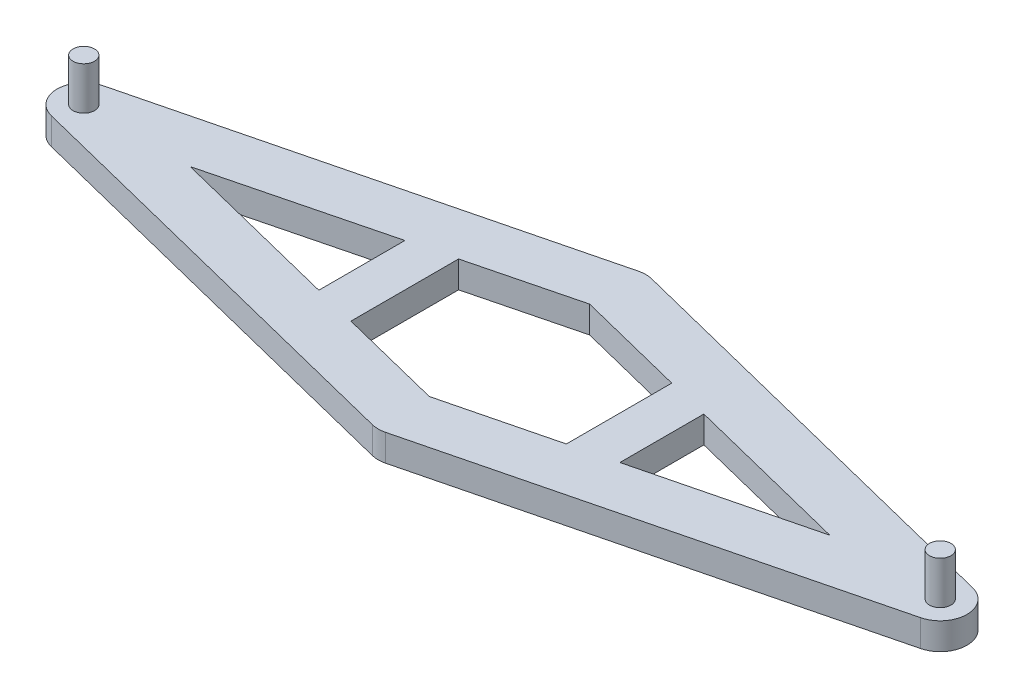
ISO-10303-21;
HEADER;
FILE_DESCRIPTION(('STEP AP214'),'2;1');
FILE_NAME('part.step','',(''),(''),'','','');
FILE_SCHEMA(('AUTOMOTIVE_DESIGN { 1 0 10303 214 1 1 1 1 }'));
ENDSEC;
DATA;
#1=APPLICATION_CONTEXT('core data for automotive mechanical design processes');
#2=APPLICATION_PROTOCOL_DEFINITION('international standard','automotive_design',2000,#1);
#3=PRODUCT_CONTEXT('',#1,'mechanical');
#4=PRODUCT('Part','Part','',(#3));
#5=PRODUCT_RELATED_PRODUCT_CATEGORY('part','',(#4));
#6=PRODUCT_DEFINITION_FORMATION('','',#4);
#7=PRODUCT_DEFINITION_CONTEXT('part definition',#1,'design');
#8=PRODUCT_DEFINITION('design','',#6,#7);
#9=PRODUCT_DEFINITION_SHAPE('','',#8);
#10=(LENGTH_UNIT() NAMED_UNIT(*) SI_UNIT(.MILLI.,.METRE.));
#11=(NAMED_UNIT(*) PLANE_ANGLE_UNIT() SI_UNIT($,.RADIAN.));
#12=(NAMED_UNIT(*) SI_UNIT($,.STERADIAN.) SOLID_ANGLE_UNIT());
#13=UNCERTAINTY_MEASURE_WITH_UNIT(LENGTH_MEASURE(1.E-05),#10,'distance_accuracy_value','');
#14=(GEOMETRIC_REPRESENTATION_CONTEXT(3) GLOBAL_UNCERTAINTY_ASSIGNED_CONTEXT((#13)) GLOBAL_UNIT_ASSIGNED_CONTEXT((#10,
#11,#12)) REPRESENTATION_CONTEXT('',''));
#15=CARTESIAN_POINT('',(0.,0.,0.));
#16=DIRECTION('',(0.,0.,1.));
#17=DIRECTION('',(1.,0.,0.));
#18=AXIS2_PLACEMENT_3D('',#15,#16,#17);
#19=CARTESIAN_POINT('',(-0.294525173858239,3.175,-9.50091620313037));
#20=DIRECTION('',(-0.242535625036084,0.,0.970142500145394));
#21=DIRECTION('',(0.970142500145394,0.,0.242535625036084));
#22=AXIS2_PLACEMENT_3D('',#19,#20,#21);
#23=PLANE('',#22);
#24=DIRECTION('',(0.,-1.,0.));
#25=VECTOR('',#24,1.);
#26=CARTESIAN_POINT('',(12.7,3.175,-6.25228490966936));
#27=LINE('',#26,#25);
#28=CARTESIAN_POINT('',(12.7,3.175,-6.25228490966936));
#29=VERTEX_POINT('',#28);
#30=CARTESIAN_POINT('',(12.7,0.,-6.25228490966936));
#31=VERTEX_POINT('',#30);
#32=EDGE_CURVE('E171',#29,#31,#27,.T.);
#33=ORIENTED_EDGE('',*,*,#32,.F.);
#34=DIRECTION('',(-0.970142500145394,0.,-0.242535625036084));
#35=VECTOR('',#34,1.);
#36=CARTESIAN_POINT('',(-0.294525173858239,3.175,-9.50091620313037));
#37=LINE('',#36,#35);
#38=CARTESIAN_POINT('',(-0.294525173858239,3.175,-9.50091620313037));
#39=VERTEX_POINT('',#38);
#40=EDGE_CURVE('E187',#29,#39,#37,.T.);
#41=ORIENTED_EDGE('',*,*,#40,.T.);
#42=DIRECTION('',(0.,-1.,0.));
#43=VECTOR('',#42,1.);
#44=CARTESIAN_POINT('',(-0.294525173858239,3.175,-9.50091620313037));
#45=LINE('',#44,#43);
#46=CARTESIAN_POINT('',(-0.294525173858239,0.,-9.50091620313037));
#47=VERTEX_POINT('',#46);
#48=EDGE_CURVE('E204',#39,#47,#45,.T.);
#49=ORIENTED_EDGE('',*,*,#48,.T.);
#50=DIRECTION('',(-0.970142500145394,0.,-0.242535625036084));
#51=VECTOR('',#50,1.);
#52=CARTESIAN_POINT('',(-0.294525173858239,0.,-9.50091620313037));
#53=LINE('',#52,#51);
#54=EDGE_CURVE('E289',#31,#47,#53,.T.);
#55=ORIENTED_EDGE('',*,*,#54,.F.);
#56=EDGE_LOOP('',(#33,#41,#49,#55));
#57=FACE_BOUND('',#56,.T.);
#58=ADVANCED_FACE('F33',(#57),#23,.T.);
#59=CARTESIAN_POINT('',(37.7091396387047,3.175,0.));
#60=DIRECTION('',(-0.242535625036085,0.,-0.970142500145394));
#61=DIRECTION('',(-0.970142500145394,0.,0.242535625036085));
#62=AXIS2_PLACEMENT_3D('',#59,#60,#61);
#63=PLANE('',#62);
#64=DIRECTION('',(0.,1.,0.));
#65=VECTOR('',#64,1.);
#66=CARTESIAN_POINT('',(12.7,3.175,6.2522849096694));
#67=LINE('',#66,#65);
#68=CARTESIAN_POINT('',(12.7,0.,6.2522849096694));
#69=VERTEX_POINT('',#68);
#70=CARTESIAN_POINT('',(12.7,3.175,6.2522849096694));
#71=VERTEX_POINT('',#70);
#72=EDGE_CURVE('E11',#69,#71,#67,.T.);
#73=ORIENTED_EDGE('',*,*,#72,.F.);
#74=DIRECTION('',(0.970142500145394,0.,-0.242535625036085));
#75=VECTOR('',#74,1.);
#76=CARTESIAN_POINT('',(37.7091396387047,0.,0.));
#77=LINE('',#76,#75);
#78=CARTESIAN_POINT('',(-0.307385689264475,0.,9.50413133198198));
#79=VERTEX_POINT('',#78);
#80=EDGE_CURVE('E180',#79,#69,#77,.T.);
#81=ORIENTED_EDGE('',*,*,#80,.F.);
#82=DIRECTION('',(0.,-1.,0.));
#83=VECTOR('',#82,1.);
#84=CARTESIAN_POINT('',(-0.307385689264475,3.175,9.50413133198198));
#85=LINE('',#84,#83);
#86=CARTESIAN_POINT('',(-0.307385689264472,3.175,9.50413133198199));
#87=VERTEX_POINT('',#86);
#88=EDGE_CURVE('E199',#87,#79,#85,.T.);
#89=ORIENTED_EDGE('',*,*,#88,.F.);
#90=DIRECTION('',(0.970142500145394,0.,-0.242535625036085));
#91=VECTOR('',#90,1.);
#92=CARTESIAN_POINT('',(37.7091396387047,3.175,0.));
#93=LINE('',#92,#91);
#94=EDGE_CURVE('E182',#87,#71,#93,.T.);
#95=ORIENTED_EDGE('',*,*,#94,.T.);
#96=EDGE_LOOP('',(#73,#81,#89,#95));
#97=FACE_BOUND('',#96,.T.);
#98=ADVANCED_FACE('F178',(#97),#63,.T.);
#99=CARTESIAN_POINT('',(-38.111149391785,3.175,0.0652214884911534));
#100=DIRECTION('',(0.245236567026518,0.,0.969463267067426));
#101=DIRECTION('',(0.969463267067426,0.,-0.245236567026518));
#102=AXIS2_PLACEMENT_3D('',#99,#100,#101);
#103=PLANE('',#102);
#104=DIRECTION('',(0.,1.,0.));
#105=VECTOR('',#104,1.);
#106=CARTESIAN_POINT('',(-12.7,3.175,-6.36281271634266));
#107=LINE('',#106,#105);
#108=CARTESIAN_POINT('',(-12.7,0.,-6.36281271634266));
#109=VERTEX_POINT('',#108);
#110=CARTESIAN_POINT('',(-12.7,3.175,-6.36281271634266));
#111=VERTEX_POINT('',#110);
#112=EDGE_CURVE('E331',#109,#111,#107,.T.);
#113=ORIENTED_EDGE('',*,*,#112,.F.);
#114=DIRECTION('',(-0.969463267067426,0.,0.245236567026518));
#115=VECTOR('',#114,1.);
#116=CARTESIAN_POINT('',(-38.111149391785,0.,0.0652214884911534));
#117=LINE('',#116,#115);
#118=EDGE_CURVE('E291',#47,#109,#117,.T.);
#119=ORIENTED_EDGE('',*,*,#118,.F.);
#120=ORIENTED_EDGE('',*,*,#48,.F.);
#121=DIRECTION('',(-0.969463267067426,0.,0.245236567026518));
#122=VECTOR('',#121,1.);
#123=CARTESIAN_POINT('',(-38.111149391785,3.175,0.0652214884911534));
#124=LINE('',#123,#122);
#125=EDGE_CURVE('E344',#39,#111,#124,.T.);
#126=ORIENTED_EDGE('',*,*,#125,.T.);
#127=EDGE_LOOP('',(#113,#119,#120,#126));
#128=FACE_BOUND('',#127,.T.);
#129=ADVANCED_FACE('F367',(#128),#103,.T.);
#130=CARTESIAN_POINT('',(-0.307385689264475,3.175,9.50413133198198));
#131=DIRECTION('',(0.242245005364423,0.,-0.970215108816592));
#132=DIRECTION('',(-0.970215108816592,0.,-0.242245005364423));
#133=AXIS2_PLACEMENT_3D('',#130,#131,#132);
#134=PLANE('',#133);
#135=DIRECTION('',(0.,-1.,0.));
#136=VECTOR('',#135,1.);
#137=CARTESIAN_POINT('',(-12.7,3.175,6.40992171505996));
#138=LINE('',#137,#136);
#139=CARTESIAN_POINT('',(-12.7,3.175,6.40992171505996));
#140=VERTEX_POINT('',#139);
#141=CARTESIAN_POINT('',(-12.7,0.,6.40992171505996));
#142=VERTEX_POINT('',#141);
#143=EDGE_CURVE('E267',#140,#142,#138,.T.);
#144=ORIENTED_EDGE('',*,*,#143,.F.);
#145=DIRECTION('',(0.970215108816592,0.,0.242245005364423));
#146=VECTOR('',#145,1.);
#147=CARTESIAN_POINT('',(-0.307385689264475,3.175,9.50413133198198));
#148=LINE('',#147,#146);
#149=EDGE_CURVE('E346',#140,#87,#148,.T.);
#150=ORIENTED_EDGE('',*,*,#149,.T.);
#151=ORIENTED_EDGE('',*,*,#88,.T.);
#152=DIRECTION('',(0.970215108816592,0.,0.242245005364423));
#153=VECTOR('',#152,1.);
#154=CARTESIAN_POINT('',(-0.307385689264475,0.,9.50413133198198));
#155=LINE('',#154,#153);
#156=EDGE_CURVE('E185',#142,#79,#155,.T.);
#157=ORIENTED_EDGE('',*,*,#156,.F.);
#158=EDGE_LOOP('',(#144,#150,#151,#157));
#159=FACE_BOUND('',#158,.T.);
#160=ADVANCED_FACE('F351',(#159),#134,.T.);
#161=CARTESIAN_POINT('',(-50.8000000000543,3.175,0.));
#162=DIRECTION('',(0.,1.,0.));
#163=DIRECTION('',(0.,0.,1.));
#164=AXIS2_PLACEMENT_3D('',#161,#162,#163);
#165=PLANE('',#164);
#166=ORIENTED_EDGE('',*,*,#40,.F.);
#167=DIRECTION('',(0.,0.,1.));
#168=VECTOR('',#167,1.);
#169=CARTESIAN_POINT('',(12.7,3.175,8.25500000000475));
#170=LINE('',#169,#168);
#171=EDGE_CURVE('E173',#29,#71,#170,.T.);
#172=ORIENTED_EDGE('',*,*,#171,.T.);
#173=ORIENTED_EDGE('',*,*,#94,.F.);
#174=ORIENTED_EDGE('',*,*,#149,.F.);
#175=DIRECTION('',(0.,0.,-1.));
#176=VECTOR('',#175,1.);
#177=CARTESIAN_POINT('',(-12.7,3.175,8.25500000000467));
#178=LINE('',#177,#176);
#179=EDGE_CURVE('E320',#140,#111,#178,.T.);
#180=ORIENTED_EDGE('',*,*,#179,.T.);
#181=ORIENTED_EDGE('',*,*,#125,.F.);
#182=EDGE_LOOP('',(#166,#172,#173,#174,#180,#181));
#183=FACE_BOUND('',#182,.T.);
#184=CARTESIAN_POINT('',(17.78,3.175,4.98228490967078));
#185=VERTEX_POINT('',#184);
#186=CARTESIAN_POINT('',(37.7091396387047,3.175,0.));
#187=VERTEX_POINT('',#186);
#188=EDGE_CURVE('E347',#185,#187,#93,.T.);
#189=ORIENTED_EDGE('',*,*,#188,.F.);
#190=DIRECTION('',(0.,0.,-1.));
#191=VECTOR('',#190,1.);
#192=CARTESIAN_POINT('',(17.78,3.175,8.25500000000475));
#193=LINE('',#192,#191);
#194=CARTESIAN_POINT('',(17.78,3.175,-4.98228490967074));
#195=VERTEX_POINT('',#194);
#196=EDGE_CURVE('E275',#185,#195,#193,.T.);
#197=ORIENTED_EDGE('',*,*,#196,.T.);
#198=EDGE_CURVE('E190',#187,#195,#37,.T.);
#199=ORIENTED_EDGE('',*,*,#198,.F.);
#200=EDGE_LOOP('',(#189,#197,#199));
#201=FACE_BOUND('',#200,.T.);
#202=CARTESIAN_POINT('',(-17.78,3.175,-5.07776994802489));
#203=VERTEX_POINT('',#202);
#204=CARTESIAN_POINT('',(-38.111149391785,3.175,0.0652214884911534));
#205=VERTEX_POINT('',#204);
#206=EDGE_CURVE('E319',#203,#205,#124,.T.);
#207=ORIENTED_EDGE('',*,*,#206,.F.);
#208=DIRECTION('',(0.,0.,1.));
#209=VECTOR('',#208,1.);
#210=CARTESIAN_POINT('',(-17.78,3.175,-8.25500000000475));
#211=LINE('',#210,#209);
#212=CARTESIAN_POINT('',(-17.78,3.175,5.14153842967463));
#213=VERTEX_POINT('',#212);
#214=EDGE_CURVE('E313',#203,#213,#211,.T.);
#215=ORIENTED_EDGE('',*,*,#214,.T.);
#216=EDGE_CURVE('E309',#205,#213,#148,.T.);
#217=ORIENTED_EDGE('',*,*,#216,.F.);
#218=EDGE_LOOP('',(#207,#215,#217));
#219=FACE_BOUND('',#218,.T.);
#220=CARTESIAN_POINT('',(50.8000000000543,3.175,0.));
#221=DIRECTION('',(0.,1.,0.));
#222=DIRECTION('',(0.,0.,1.));
#223=AXIS2_PLACEMENT_3D('',#220,#221,#222);
#224=CIRCLE('',#223,1.27);
#225=CARTESIAN_POINT('',(50.8000000000543,3.175,1.27));
#226=VERTEX_POINT('',#225);
#227=EDGE_CURVE('E333',#226,#226,#224,.T.);
#228=ORIENTED_EDGE('',*,*,#227,.F.);
#229=EDGE_LOOP('',(#228));
#230=FACE_BOUND('',#229,.T.);
#231=CARTESIAN_POINT('',(-50.8000000000543,3.175,0.));
#232=DIRECTION('',(0.,1.,0.));
#233=DIRECTION('',(0.,0.,1.));
#234=AXIS2_PLACEMENT_3D('',#231,#232,#233);
#235=CIRCLE('',#234,1.27);
#236=CARTESIAN_POINT('',(-50.8000000000543,3.175,1.27));
#237=VERTEX_POINT('',#236);
#238=EDGE_CURVE('E337',#237,#237,#235,.T.);
#239=ORIENTED_EDGE('',*,*,#238,.F.);
#240=EDGE_LOOP('',(#239));
#241=FACE_BOUND('',#240,.T.);
#242=CARTESIAN_POINT('',(-50.8000000000543,3.175,0.));
#243=DIRECTION('',(0.,1.,0.));
#244=DIRECTION('',(0.,0.,1.));
#245=AXIS2_PLACEMENT_3D('',#242,#243,#244);
#246=CIRCLE('',#245,3.175);
#247=CARTESIAN_POINT('',(-51.5700506095438,3.175,-3.08020243796162));
#248=VERTEX_POINT('',#247);
#249=CARTESIAN_POINT('',(-51.5700506095438,3.175,3.08020243796162));
#250=VERTEX_POINT('',#249);
#251=EDGE_CURVE('E208',#248,#250,#246,.T.);
#252=ORIENTED_EDGE('',*,*,#251,.T.);
#253=DIRECTION('',(0.970142500145393,0.,0.242535625036088));
#254=VECTOR('',#253,1.);
#255=CARTESIAN_POINT('',(-51.5700506095438,3.175,3.08020243796162));
#256=LINE('',#255,#254);
#257=CARTESIAN_POINT('',(-0.77005060948961,3.175,15.7802024379616));
#258=VERTEX_POINT('',#257);
#259=EDGE_CURVE('E211',#250,#258,#256,.T.);
#260=ORIENTED_EDGE('',*,*,#259,.T.);
#261=CARTESIAN_POINT('',(0.,3.175,12.6999999999999));
#262=DIRECTION('',(0.,1.,0.));
#263=DIRECTION('',(0.,0.,1.));
#264=AXIS2_PLACEMENT_3D('',#261,#262,#263);
#265=CIRCLE('',#264,3.17500000000012);
#266=CARTESIAN_POINT('',(0.770050609489601,3.175,15.7802024379617));
#267=VERTEX_POINT('',#266);
#268=EDGE_CURVE('E214',#258,#267,#265,.T.);
#269=ORIENTED_EDGE('',*,*,#268,.T.);
#270=DIRECTION('',(0.970142500145393,0.,-0.24253562503609));
#271=VECTOR('',#270,1.);
#272=CARTESIAN_POINT('',(51.5700506095438,3.175,3.08020243796162));
#273=LINE('',#272,#271);
#274=CARTESIAN_POINT('',(51.5700506095438,3.175,3.08020243796162));
#275=VERTEX_POINT('',#274);
#276=EDGE_CURVE('E216',#267,#275,#273,.T.);
#277=ORIENTED_EDGE('',*,*,#276,.T.);
#278=CARTESIAN_POINT('',(50.8000000000543,3.175,0.));
#279=DIRECTION('',(0.,1.,0.));
#280=DIRECTION('',(0.,0.,1.));
#281=AXIS2_PLACEMENT_3D('',#278,#279,#280);
#282=CIRCLE('',#281,3.175);
#283=CARTESIAN_POINT('',(51.5700506095438,3.175,-3.08020243796162));
#284=VERTEX_POINT('',#283);
#285=EDGE_CURVE('E218',#275,#284,#282,.T.);
#286=ORIENTED_EDGE('',*,*,#285,.T.);
#287=DIRECTION('',(-0.970142500145393,0.,-0.24253562503609));
#288=VECTOR('',#287,1.);
#289=CARTESIAN_POINT('',(0.770050609489601,3.175,-15.7802024379617));
#290=LINE('',#289,#288);
#291=CARTESIAN_POINT('',(0.7700506094896,3.175,-15.7802024379617));
#292=VERTEX_POINT('',#291);
#293=EDGE_CURVE('E220',#284,#292,#290,.T.);
#294=ORIENTED_EDGE('',*,*,#293,.T.);
#295=CARTESIAN_POINT('',(0.,3.175,-12.7));
#296=DIRECTION('',(0.,1.,0.));
#297=DIRECTION('',(0.,0.,1.));
#298=AXIS2_PLACEMENT_3D('',#295,#296,#297);
#299=CIRCLE('',#298,3.17500000000006);
#300=CARTESIAN_POINT('',(-0.770050609489601,3.175,-15.7802024379617));
#301=VERTEX_POINT('',#300);
#302=EDGE_CURVE('E222',#292,#301,#299,.T.);
#303=ORIENTED_EDGE('',*,*,#302,.T.);
#304=DIRECTION('',(-0.970142500145393,0.,0.24253562503609));
#305=VECTOR('',#304,1.);
#306=CARTESIAN_POINT('',(-51.5700506095438,3.175,-3.08020243796162));
#307=LINE('',#306,#305);
#308=EDGE_CURVE('E224',#301,#248,#307,.T.);
#309=ORIENTED_EDGE('',*,*,#308,.T.);
#310=EDGE_LOOP('',(#252,#260,#269,#277,#286,#294,#303,#309));
#311=FACE_BOUND('',#310,.T.);
#312=ADVANCED_FACE('F317',(#183,#201,#219,#230,#241,#311),#165,.T.);
#313=CARTESIAN_POINT('',(-50.8000000000543,0.,0.));
#314=DIRECTION('',(0.,1.,0.));
#315=DIRECTION('',(0.,0.,1.));
#316=AXIS2_PLACEMENT_3D('',#313,#314,#315);
#317=PLANE('',#316);
#318=DIRECTION('',(0.,0.,-1.));
#319=VECTOR('',#318,1.);
#320=CARTESIAN_POINT('',(12.7,0.,8.25500000000475));
#321=LINE('',#320,#319);
#322=EDGE_CURVE('E48',#69,#31,#321,.T.);
#323=ORIENTED_EDGE('',*,*,#322,.T.);
#324=ORIENTED_EDGE('',*,*,#54,.T.);
#325=ORIENTED_EDGE('',*,*,#118,.T.);
#326=DIRECTION('',(0.,0.,1.));
#327=VECTOR('',#326,1.);
#328=CARTESIAN_POINT('',(-12.7,0.,8.25500000000467));
#329=LINE('',#328,#327);
#330=EDGE_CURVE('E323',#109,#142,#329,.T.);
#331=ORIENTED_EDGE('',*,*,#330,.T.);
#332=ORIENTED_EDGE('',*,*,#156,.T.);
#333=ORIENTED_EDGE('',*,*,#80,.T.);
#334=EDGE_LOOP('',(#323,#324,#325,#331,#332,#333));
#335=FACE_BOUND('',#334,.T.);
#336=DIRECTION('',(0.,0.,1.));
#337=VECTOR('',#336,1.);
#338=CARTESIAN_POINT('',(17.78,0.,8.25500000000475));
#339=LINE('',#338,#337);
#340=CARTESIAN_POINT('',(17.78,0.,-4.98228490967074));
#341=VERTEX_POINT('',#340);
#342=CARTESIAN_POINT('',(17.78,0.,4.98228490967077));
#343=VERTEX_POINT('',#342);
#344=EDGE_CURVE('E56',#341,#343,#339,.T.);
#345=ORIENTED_EDGE('',*,*,#344,.T.);
#346=CARTESIAN_POINT('',(37.7091396387047,0.,0.));
#347=VERTEX_POINT('',#346);
#348=EDGE_CURVE('E188',#343,#347,#77,.T.);
#349=ORIENTED_EDGE('',*,*,#348,.T.);
#350=EDGE_CURVE('E282',#347,#341,#53,.T.);
#351=ORIENTED_EDGE('',*,*,#350,.T.);
#352=EDGE_LOOP('',(#345,#349,#351));
#353=FACE_BOUND('',#352,.T.);
#354=DIRECTION('',(0.,0.,-1.));
#355=VECTOR('',#354,1.);
#356=CARTESIAN_POINT('',(-17.78,0.,-8.25500000000475));
#357=LINE('',#356,#355);
#358=CARTESIAN_POINT('',(-17.78,0.,5.14153842967463));
#359=VERTEX_POINT('',#358);
#360=CARTESIAN_POINT('',(-17.78,0.,-5.07776994802489));
#361=VERTEX_POINT('',#360);
#362=EDGE_CURVE('E300',#359,#361,#357,.T.);
#363=ORIENTED_EDGE('',*,*,#362,.T.);
#364=CARTESIAN_POINT('',(-38.111149391785,0.,0.0652214884911534));
#365=VERTEX_POINT('',#364);
#366=EDGE_CURVE('E288',#361,#365,#117,.T.);
#367=ORIENTED_EDGE('',*,*,#366,.T.);
#368=EDGE_CURVE('E192',#365,#359,#155,.T.);
#369=ORIENTED_EDGE('',*,*,#368,.T.);
#370=EDGE_LOOP('',(#363,#367,#369));
#371=FACE_BOUND('',#370,.T.);
#372=CARTESIAN_POINT('',(-50.8000000000543,0.,0.));
#373=DIRECTION('',(0.,1.,0.));
#374=DIRECTION('',(0.,0.,1.));
#375=AXIS2_PLACEMENT_3D('',#372,#373,#374);
#376=CIRCLE('',#375,3.175);
#377=CARTESIAN_POINT('',(-51.5700506095438,0.,-3.08020243796162));
#378=VERTEX_POINT('',#377);
#379=CARTESIAN_POINT('',(-51.5700506095438,0.,3.08020243796162));
#380=VERTEX_POINT('',#379);
#381=EDGE_CURVE('E207',#378,#380,#376,.T.);
#382=ORIENTED_EDGE('',*,*,#381,.F.);
#383=DIRECTION('',(-0.970142500145393,0.,0.24253562503609));
#384=VECTOR('',#383,1.);
#385=CARTESIAN_POINT('',(-51.5700506095438,0.,-3.08020243796162));
#386=LINE('',#385,#384);
#387=CARTESIAN_POINT('',(-0.770050609489601,0.,-15.7802024379617));
#388=VERTEX_POINT('',#387);
#389=EDGE_CURVE('E212',#388,#378,#386,.T.);
#390=ORIENTED_EDGE('',*,*,#389,.F.);
#391=CARTESIAN_POINT('',(0.,0.,-12.7));
#392=DIRECTION('',(0.,1.,0.));
#393=DIRECTION('',(0.,0.,1.));
#394=AXIS2_PLACEMENT_3D('',#391,#392,#393);
#395=CIRCLE('',#394,3.17500000000006);
#396=CARTESIAN_POINT('',(0.7700506094896,0.,-15.7802024379617));
#397=VERTEX_POINT('',#396);
#398=EDGE_CURVE('E239',#397,#388,#395,.T.);
#399=ORIENTED_EDGE('',*,*,#398,.F.);
#400=DIRECTION('',(-0.970142500145393,0.,-0.24253562503609));
#401=VECTOR('',#400,1.);
#402=CARTESIAN_POINT('',(0.770050609489601,0.,-15.7802024379617));
#403=LINE('',#402,#401);
#404=CARTESIAN_POINT('',(51.5700506095438,0.,-3.08020243796162));
#405=VERTEX_POINT('',#404);
#406=EDGE_CURVE('E237',#405,#397,#403,.T.);
#407=ORIENTED_EDGE('',*,*,#406,.F.);
#408=CARTESIAN_POINT('',(50.8000000000543,0.,0.));
#409=DIRECTION('',(0.,1.,0.));
#410=DIRECTION('',(0.,0.,1.));
#411=AXIS2_PLACEMENT_3D('',#408,#409,#410);
#412=CIRCLE('',#411,3.175);
#413=CARTESIAN_POINT('',(51.5700506095438,0.,3.08020243796162));
#414=VERTEX_POINT('',#413);
#415=EDGE_CURVE('E235',#414,#405,#412,.T.);
#416=ORIENTED_EDGE('',*,*,#415,.F.);
#417=DIRECTION('',(0.970142500145393,0.,-0.24253562503609));
#418=VECTOR('',#417,1.);
#419=CARTESIAN_POINT('',(51.5700506095438,0.,3.08020243796162));
#420=LINE('',#419,#418);
#421=CARTESIAN_POINT('',(0.770050609489601,0.,15.7802024379617));
#422=VERTEX_POINT('',#421);
#423=EDGE_CURVE('E233',#422,#414,#420,.T.);
#424=ORIENTED_EDGE('',*,*,#423,.F.);
#425=CARTESIAN_POINT('',(0.,0.,12.6999999999999));
#426=DIRECTION('',(0.,1.,0.));
#427=DIRECTION('',(0.,0.,1.));
#428=AXIS2_PLACEMENT_3D('',#425,#426,#427);
#429=CIRCLE('',#428,3.17500000000012);
#430=CARTESIAN_POINT('',(-0.77005060948961,0.,15.7802024379616));
#431=VERTEX_POINT('',#430);
#432=EDGE_CURVE('E231',#431,#422,#429,.T.);
#433=ORIENTED_EDGE('',*,*,#432,.F.);
#434=DIRECTION('',(0.970142500145393,0.,0.242535625036088));
#435=VECTOR('',#434,1.);
#436=CARTESIAN_POINT('',(-51.5700506095438,0.,3.08020243796162));
#437=LINE('',#436,#435);
#438=EDGE_CURVE('E229',#380,#431,#437,.T.);
#439=ORIENTED_EDGE('',*,*,#438,.F.);
#440=EDGE_LOOP('',(#382,#390,#399,#407,#416,#424,#433,#439));
#441=FACE_BOUND('',#440,.T.);
#442=ADVANCED_FACE('F183',(#335,#353,#371,#441),#317,.F.);
#443=CARTESIAN_POINT('',(-50.8000000000543,3.175,0.));
#444=DIRECTION('',(0.,-1.,0.));
#445=DIRECTION('',(0.,0.,-1.));
#446=AXIS2_PLACEMENT_3D('',#443,#444,#445);
#447=CYLINDRICAL_SURFACE('',#446,3.175);
#448=ORIENTED_EDGE('',*,*,#381,.T.);
#449=DIRECTION('',(0.,-1.,0.));
#450=VECTOR('',#449,1.);
#451=CARTESIAN_POINT('',(-51.5700506095438,3.175,3.08020243796162));
#452=LINE('',#451,#450);
#453=EDGE_CURVE('E262',#250,#380,#452,.T.);
#454=ORIENTED_EDGE('',*,*,#453,.F.);
#455=ORIENTED_EDGE('',*,*,#251,.F.);
#456=DIRECTION('',(0.,-1.,0.));
#457=VECTOR('',#456,1.);
#458=CARTESIAN_POINT('',(-51.5700506095438,3.175,-3.08020243796162));
#459=LINE('',#458,#457);
#460=EDGE_CURVE('E226',#248,#378,#459,.T.);
#461=ORIENTED_EDGE('',*,*,#460,.T.);
#462=EDGE_LOOP('',(#448,#454,#455,#461));
#463=FACE_BOUND('',#462,.T.);
#464=ADVANCED_FACE('F35',(#463),#447,.T.);
#465=CARTESIAN_POINT('',(-51.5700506095438,3.175,3.08020243796162));
#466=DIRECTION('',(0.242535625036088,0.,-0.970142500145393));
#467=DIRECTION('',(-0.970142500145393,0.,-0.242535625036088));
#468=AXIS2_PLACEMENT_3D('',#465,#466,#467);
#469=PLANE('',#468);
#470=ORIENTED_EDGE('',*,*,#438,.T.);
#471=DIRECTION('',(0.,-1.,0.));
#472=VECTOR('',#471,1.);
#473=CARTESIAN_POINT('',(-0.77005060948961,3.175,15.7802024379616));
#474=LINE('',#473,#472);
#475=EDGE_CURVE('E259',#258,#431,#474,.T.);
#476=ORIENTED_EDGE('',*,*,#475,.F.);
#477=ORIENTED_EDGE('',*,*,#259,.F.);
#478=ORIENTED_EDGE('',*,*,#453,.T.);
#479=EDGE_LOOP('',(#470,#476,#477,#478));
#480=FACE_BOUND('',#479,.T.);
#481=ADVANCED_FACE('F408',(#480),#469,.F.);
#482=CARTESIAN_POINT('',(0.,3.175,12.6999999999999));
#483=DIRECTION('',(0.,-1.,0.));
#484=DIRECTION('',(0.,0.,-1.));
#485=AXIS2_PLACEMENT_3D('',#482,#483,#484);
#486=CYLINDRICAL_SURFACE('',#485,3.17500000000012);
#487=ORIENTED_EDGE('',*,*,#432,.T.);
#488=DIRECTION('',(0.,-1.,0.));
#489=VECTOR('',#488,1.);
#490=CARTESIAN_POINT('',(0.770050609489601,3.175,15.7802024379617));
#491=LINE('',#490,#489);
#492=EDGE_CURVE('E256',#267,#422,#491,.T.);
#493=ORIENTED_EDGE('',*,*,#492,.F.);
#494=ORIENTED_EDGE('',*,*,#268,.F.);
#495=ORIENTED_EDGE('',*,*,#475,.T.);
#496=EDGE_LOOP('',(#487,#493,#494,#495));
#497=FACE_BOUND('',#496,.T.);
#498=ADVANCED_FACE('F405',(#497),#486,.T.);
#499=CARTESIAN_POINT('',(51.5700506095438,3.175,3.08020243796162));
#500=DIRECTION('',(-0.24253562503609,0.,-0.970142500145392));
#501=DIRECTION('',(-0.970142500145393,0.,0.24253562503609));
#502=AXIS2_PLACEMENT_3D('',#499,#500,#501);
#503=PLANE('',#502);
#504=ORIENTED_EDGE('',*,*,#423,.T.);
#505=DIRECTION('',(0.,-1.,0.));
#506=VECTOR('',#505,1.);
#507=CARTESIAN_POINT('',(51.5700506095438,3.175,3.08020243796162));
#508=LINE('',#507,#506);
#509=EDGE_CURVE('E253',#275,#414,#508,.T.);
#510=ORIENTED_EDGE('',*,*,#509,.F.);
#511=ORIENTED_EDGE('',*,*,#276,.F.);
#512=ORIENTED_EDGE('',*,*,#492,.T.);
#513=EDGE_LOOP('',(#504,#510,#511,#512));
#514=FACE_BOUND('',#513,.T.);
#515=ADVANCED_FACE('F401',(#514),#503,.F.);
#516=CARTESIAN_POINT('',(50.8000000000543,3.175,0.));
#517=DIRECTION('',(0.,-1.,0.));
#518=DIRECTION('',(0.,0.,-1.));
#519=AXIS2_PLACEMENT_3D('',#516,#517,#518);
#520=CYLINDRICAL_SURFACE('',#519,3.175);
#521=ORIENTED_EDGE('',*,*,#415,.T.);
#522=DIRECTION('',(0.,-1.,0.));
#523=VECTOR('',#522,1.);
#524=CARTESIAN_POINT('',(51.5700506095438,3.175,-3.08020243796162));
#525=LINE('',#524,#523);
#526=EDGE_CURVE('E250',#284,#405,#525,.T.);
#527=ORIENTED_EDGE('',*,*,#526,.F.);
#528=ORIENTED_EDGE('',*,*,#285,.F.);
#529=ORIENTED_EDGE('',*,*,#509,.T.);
#530=EDGE_LOOP('',(#521,#527,#528,#529));
#531=FACE_BOUND('',#530,.T.);
#532=ADVANCED_FACE('F397',(#531),#520,.T.);
#533=CARTESIAN_POINT('',(0.770050609489601,3.175,-15.7802024379617));
#534=DIRECTION('',(-0.24253562503609,0.,0.970142500145392));
#535=DIRECTION('',(0.970142500145393,0.,0.24253562503609));
#536=AXIS2_PLACEMENT_3D('',#533,#534,#535);
#537=PLANE('',#536);
#538=ORIENTED_EDGE('',*,*,#406,.T.);
#539=DIRECTION('',(0.,-1.,0.));
#540=VECTOR('',#539,1.);
#541=CARTESIAN_POINT('',(0.7700506094896,3.175,-15.7802024379617));
#542=LINE('',#541,#540);
#543=EDGE_CURVE('E247',#292,#397,#542,.T.);
#544=ORIENTED_EDGE('',*,*,#543,.F.);
#545=ORIENTED_EDGE('',*,*,#293,.F.);
#546=ORIENTED_EDGE('',*,*,#526,.T.);
#547=EDGE_LOOP('',(#538,#544,#545,#546));
#548=FACE_BOUND('',#547,.T.);
#549=ADVANCED_FACE('F391',(#548),#537,.F.);
#550=CARTESIAN_POINT('',(0.,3.175,-12.7));
#551=DIRECTION('',(0.,-1.,0.));
#552=DIRECTION('',(0.,0.,-1.));
#553=AXIS2_PLACEMENT_3D('',#550,#551,#552);
#554=CYLINDRICAL_SURFACE('',#553,3.17500000000006);
#555=ORIENTED_EDGE('',*,*,#398,.T.);
#556=DIRECTION('',(0.,-1.,0.));
#557=VECTOR('',#556,1.);
#558=CARTESIAN_POINT('',(-0.770050609489601,3.175,-15.7802024379617));
#559=LINE('',#558,#557);
#560=EDGE_CURVE('E244',#301,#388,#559,.T.);
#561=ORIENTED_EDGE('',*,*,#560,.F.);
#562=ORIENTED_EDGE('',*,*,#302,.F.);
#563=ORIENTED_EDGE('',*,*,#543,.T.);
#564=EDGE_LOOP('',(#555,#561,#562,#563));
#565=FACE_BOUND('',#564,.T.);
#566=ADVANCED_FACE('F385',(#565),#554,.T.);
#567=CARTESIAN_POINT('',(-51.5700506095438,3.175,-3.08020243796162));
#568=DIRECTION('',(0.24253562503609,0.,0.970142500145392));
#569=DIRECTION('',(0.970142500145393,0.,-0.24253562503609));
#570=AXIS2_PLACEMENT_3D('',#567,#568,#569);
#571=PLANE('',#570);
#572=ORIENTED_EDGE('',*,*,#389,.T.);
#573=ORIENTED_EDGE('',*,*,#460,.F.);
#574=ORIENTED_EDGE('',*,*,#308,.F.);
#575=ORIENTED_EDGE('',*,*,#560,.T.);
#576=EDGE_LOOP('',(#572,#573,#574,#575));
#577=FACE_BOUND('',#576,.T.);
#578=ADVANCED_FACE('F379',(#577),#571,.F.);
#579=DIRECTION('',(0.,1.,0.));
#580=VECTOR('',#579,1.);
#581=CARTESIAN_POINT('',(17.78,3.175,-4.98228490967075));
#582=LINE('',#581,#580);
#583=EDGE_CURVE('E287',#341,#195,#582,.T.);
#584=ORIENTED_EDGE('',*,*,#583,.F.);
#585=ORIENTED_EDGE('',*,*,#350,.F.);
#586=DIRECTION('',(0.,-1.,0.));
#587=VECTOR('',#586,1.);
#588=CARTESIAN_POINT('',(37.7091396387047,3.175,0.));
#589=LINE('',#588,#587);
#590=EDGE_CURVE('E196',#187,#347,#589,.T.);
#591=ORIENTED_EDGE('',*,*,#590,.F.);
#592=ORIENTED_EDGE('',*,*,#198,.T.);
#593=EDGE_LOOP('',(#584,#585,#591,#592));
#594=FACE_BOUND('',#593,.T.);
#595=ADVANCED_FACE('F284',(#594),#23,.T.);
#596=DIRECTION('',(0.,-1.,0.));
#597=VECTOR('',#596,1.);
#598=CARTESIAN_POINT('',(-17.78,3.175,-5.07776994802489));
#599=LINE('',#598,#597);
#600=EDGE_CURVE('E329',#203,#361,#599,.T.);
#601=ORIENTED_EDGE('',*,*,#600,.F.);
#602=ORIENTED_EDGE('',*,*,#206,.T.);
#603=DIRECTION('',(0.,-1.,0.));
#604=VECTOR('',#603,1.);
#605=CARTESIAN_POINT('',(-38.111149391785,3.175,0.0652214884911534));
#606=LINE('',#605,#604);
#607=EDGE_CURVE('E201',#205,#365,#606,.T.);
#608=ORIENTED_EDGE('',*,*,#607,.T.);
#609=ORIENTED_EDGE('',*,*,#366,.F.);
#610=EDGE_LOOP('',(#601,#602,#608,#609));
#611=FACE_BOUND('',#610,.T.);
#612=ADVANCED_FACE('F378',(#611),#103,.T.);
#613=DIRECTION('',(0.,1.,0.));
#614=VECTOR('',#613,1.);
#615=CARTESIAN_POINT('',(-17.78,3.175,5.14153842967463));
#616=LINE('',#615,#614);
#617=EDGE_CURVE('E265',#359,#213,#616,.T.);
#618=ORIENTED_EDGE('',*,*,#617,.F.);
#619=ORIENTED_EDGE('',*,*,#368,.F.);
#620=ORIENTED_EDGE('',*,*,#607,.F.);
#621=ORIENTED_EDGE('',*,*,#216,.T.);
#622=EDGE_LOOP('',(#618,#619,#620,#621));
#623=FACE_BOUND('',#622,.T.);
#624=ADVANCED_FACE('F306',(#623),#134,.T.);
#625=DIRECTION('',(0.,-1.,0.));
#626=VECTOR('',#625,1.);
#627=CARTESIAN_POINT('',(17.78,3.175,4.98228490967077));
#628=LINE('',#627,#626);
#629=EDGE_CURVE('E41',#185,#343,#628,.T.);
#630=ORIENTED_EDGE('',*,*,#629,.F.);
#631=ORIENTED_EDGE('',*,*,#188,.T.);
#632=ORIENTED_EDGE('',*,*,#590,.T.);
#633=ORIENTED_EDGE('',*,*,#348,.F.);
#634=EDGE_LOOP('',(#630,#631,#632,#633));
#635=FACE_BOUND('',#634,.T.);
#636=ADVANCED_FACE('F278',(#635),#63,.T.);
#637=CARTESIAN_POINT('',(-50.8000000000543,8.255,0.));
#638=DIRECTION('',(0.,-1.,0.));
#639=DIRECTION('',(0.,0.,-1.));
#640=AXIS2_PLACEMENT_3D('',#637,#638,#639);
#641=CYLINDRICAL_SURFACE('',#640,1.27);
#642=CARTESIAN_POINT('',(-50.8000000000543,8.255,0.));
#643=DIRECTION('',(0.,1.,0.));
#644=DIRECTION('',(0.,0.,1.));
#645=AXIS2_PLACEMENT_3D('',#642,#643,#644);
#646=CIRCLE('',#645,1.27);
#647=CARTESIAN_POINT('',(-50.8000000000543,8.255,1.27));
#648=VERTEX_POINT('',#647);
#649=EDGE_CURVE('E292',#648,#648,#646,.T.);
#650=ORIENTED_EDGE('',*,*,#649,.F.);
#651=EDGE_LOOP('',(#650));
#652=FACE_BOUND('',#651,.T.);
#653=ORIENTED_EDGE('',*,*,#238,.T.);
#654=EDGE_LOOP('',(#653));
#655=FACE_BOUND('',#654,.T.);
#656=ADVANCED_FACE('F477',(#652,#655),#641,.T.);
#657=CARTESIAN_POINT('',(-50.8000000000543,8.255,0.));
#658=DIRECTION('',(0.,1.,0.));
#659=DIRECTION('',(0.,0.,1.));
#660=AXIS2_PLACEMENT_3D('',#657,#658,#659);
#661=PLANE('',#660);
#662=ORIENTED_EDGE('',*,*,#649,.T.);
#663=EDGE_LOOP('',(#662));
#664=FACE_BOUND('',#663,.T.);
#665=ADVANCED_FACE('F523',(#664),#661,.T.);
#666=CARTESIAN_POINT('',(50.8000000000543,8.255,0.));
#667=DIRECTION('',(0.,-1.,0.));
#668=DIRECTION('',(0.,0.,-1.));
#669=AXIS2_PLACEMENT_3D('',#666,#667,#668);
#670=CYLINDRICAL_SURFACE('',#669,1.27);
#671=CARTESIAN_POINT('',(50.8000000000543,8.255,0.));
#672=DIRECTION('',(0.,1.,0.));
#673=DIRECTION('',(0.,0.,1.));
#674=AXIS2_PLACEMENT_3D('',#671,#672,#673);
#675=CIRCLE('',#674,1.27);
#676=CARTESIAN_POINT('',(50.8000000000543,8.255,1.27));
#677=VERTEX_POINT('',#676);
#678=EDGE_CURVE('E334',#677,#677,#675,.T.);
#679=ORIENTED_EDGE('',*,*,#678,.F.);
#680=EDGE_LOOP('',(#679));
#681=FACE_BOUND('',#680,.T.);
#682=ORIENTED_EDGE('',*,*,#227,.T.);
#683=EDGE_LOOP('',(#682));
#684=FACE_BOUND('',#683,.T.);
#685=ADVANCED_FACE('F519',(#681,#684),#670,.T.);
#686=CARTESIAN_POINT('',(50.8000000000543,8.255,0.));
#687=DIRECTION('',(0.,1.,0.));
#688=DIRECTION('',(0.,0.,1.));
#689=AXIS2_PLACEMENT_3D('',#686,#687,#688);
#690=PLANE('',#689);
#691=ORIENTED_EDGE('',*,*,#678,.T.);
#692=EDGE_LOOP('',(#691));
#693=FACE_BOUND('',#692,.T.);
#694=ADVANCED_FACE('F487',(#693),#690,.T.);
#695=CARTESIAN_POINT('',(-12.7,-17.273867546103,8.25500000000467));
#696=DIRECTION('',(1.,0.,0.));
#697=DIRECTION('',(0.,0.,-1.));
#698=AXIS2_PLACEMENT_3D('',#695,#696,#697);
#699=PLANE('',#698);
#700=ORIENTED_EDGE('',*,*,#330,.F.);
#701=ORIENTED_EDGE('',*,*,#112,.T.);
#702=ORIENTED_EDGE('',*,*,#179,.F.);
#703=ORIENTED_EDGE('',*,*,#143,.T.);
#704=EDGE_LOOP('',(#700,#701,#702,#703));
#705=FACE_BOUND('',#704,.T.);
#706=ADVANCED_FACE('F483',(#705),#699,.T.);
#707=CARTESIAN_POINT('',(-17.78,-17.273867546103,-8.25500000000475));
#708=DIRECTION('',(-1.,0.,0.));
#709=DIRECTION('',(0.,0.,1.));
#710=AXIS2_PLACEMENT_3D('',#707,#708,#709);
#711=PLANE('',#710);
#712=ORIENTED_EDGE('',*,*,#214,.F.);
#713=ORIENTED_EDGE('',*,*,#600,.T.);
#714=ORIENTED_EDGE('',*,*,#362,.F.);
#715=ORIENTED_EDGE('',*,*,#617,.T.);
#716=EDGE_LOOP('',(#712,#713,#714,#715));
#717=FACE_BOUND('',#716,.T.);
#718=ADVANCED_FACE('F312',(#717),#711,.T.);
#719=CARTESIAN_POINT('',(12.7,-17.273867546103,8.25500000000475));
#720=DIRECTION('',(-1.,0.,0.));
#721=DIRECTION('',(0.,0.,1.));
#722=AXIS2_PLACEMENT_3D('',#719,#720,#721);
#723=PLANE('',#722);
#724=ORIENTED_EDGE('',*,*,#171,.F.);
#725=ORIENTED_EDGE('',*,*,#32,.T.);
#726=ORIENTED_EDGE('',*,*,#322,.F.);
#727=ORIENTED_EDGE('',*,*,#72,.T.);
#728=EDGE_LOOP('',(#724,#725,#726,#727));
#729=FACE_BOUND('',#728,.T.);
#730=ADVANCED_FACE('F168',(#729),#723,.T.);
#731=CARTESIAN_POINT('',(17.78,-17.273867546103,8.25500000000475));
#732=DIRECTION('',(1.,0.,0.));
#733=DIRECTION('',(0.,0.,-1.));
#734=AXIS2_PLACEMENT_3D('',#731,#732,#733);
#735=PLANE('',#734);
#736=ORIENTED_EDGE('',*,*,#344,.F.);
#737=ORIENTED_EDGE('',*,*,#583,.T.);
#738=ORIENTED_EDGE('',*,*,#196,.F.);
#739=ORIENTED_EDGE('',*,*,#629,.T.);
#740=EDGE_LOOP('',(#736,#737,#738,#739));
#741=FACE_BOUND('',#740,.T.);
#742=ADVANCED_FACE('F272',(#741),#735,.T.);
#743=CLOSED_SHELL('',(#58,#98,#129,#160,#312,#442,#464,#481,#498,#515,#532,#549,#566,#578,#595,
#612,#624,#636,#656,#665,#685,#694,#706,#718,#730,#742));
#744=MANIFOLD_SOLID_BREP('B2',#743);
#745=ADVANCED_BREP_SHAPE_REPRESENTATION('',(#18,#744),#14);
#746=SHAPE_DEFINITION_REPRESENTATION(#9,#745);
ENDSEC;
END-ISO-10303-21;
